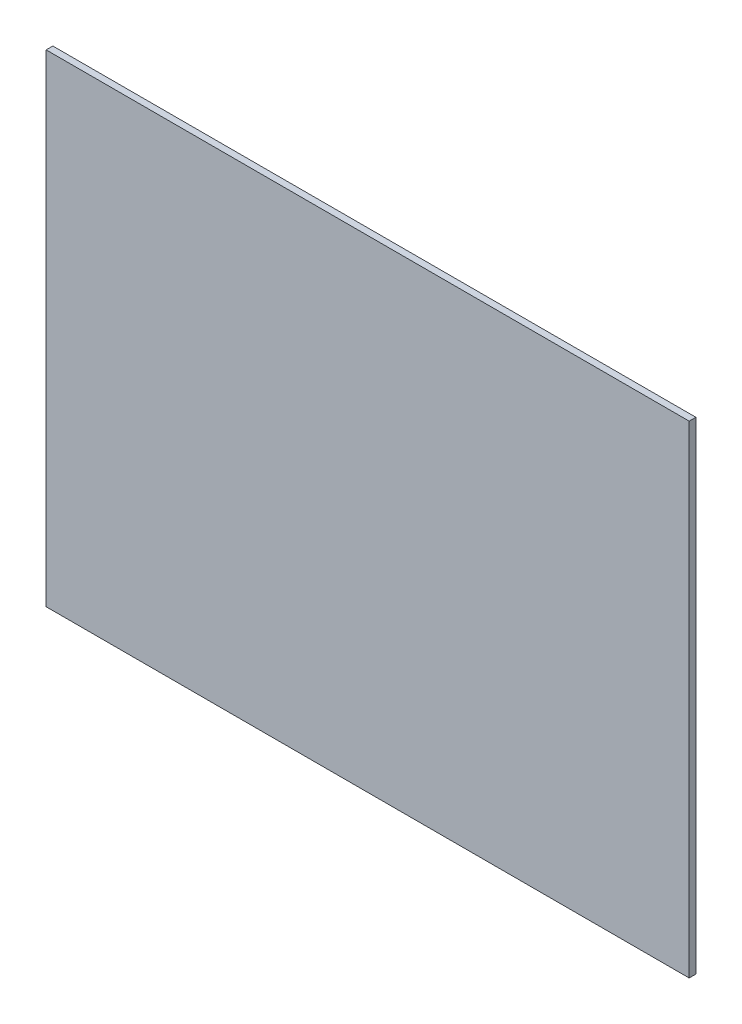
ISO-10303-21;
HEADER;
FILE_DESCRIPTION(('STEP AP214'),'2;1');
FILE_NAME('part.step','',(''),(''),'','','');
FILE_SCHEMA(('AUTOMOTIVE_DESIGN { 1 0 10303 214 1 1 1 1 }'));
ENDSEC;
DATA;
#1=APPLICATION_CONTEXT('core data for automotive mechanical design processes');
#2=APPLICATION_PROTOCOL_DEFINITION('international standard','automotive_design',2000,#1);
#3=PRODUCT_CONTEXT('',#1,'mechanical');
#4=PRODUCT('Part','Part','',(#3));
#5=PRODUCT_RELATED_PRODUCT_CATEGORY('part','',(#4));
#6=PRODUCT_DEFINITION_FORMATION('','',#4);
#7=PRODUCT_DEFINITION_CONTEXT('part definition',#1,'design');
#8=PRODUCT_DEFINITION('design','',#6,#7);
#9=PRODUCT_DEFINITION_SHAPE('','',#8);
#10=(LENGTH_UNIT() NAMED_UNIT(*) SI_UNIT(.MILLI.,.METRE.));
#11=(NAMED_UNIT(*) PLANE_ANGLE_UNIT() SI_UNIT($,.RADIAN.));
#12=(NAMED_UNIT(*) SI_UNIT($,.STERADIAN.) SOLID_ANGLE_UNIT());
#13=UNCERTAINTY_MEASURE_WITH_UNIT(LENGTH_MEASURE(1.E-05),#10,'distance_accuracy_value','');
#14=(GEOMETRIC_REPRESENTATION_CONTEXT(3) GLOBAL_UNCERTAINTY_ASSIGNED_CONTEXT((#13)) GLOBAL_UNIT_ASSIGNED_CONTEXT((#10,
#11,#12)) REPRESENTATION_CONTEXT('',''));
#15=CARTESIAN_POINT('',(0.,0.,0.));
#16=DIRECTION('',(0.,0.,1.));
#17=DIRECTION('',(1.,0.,0.));
#18=AXIS2_PLACEMENT_3D('',#15,#16,#17);
#19=CARTESIAN_POINT('',(304.8,228.6,6.35));
#20=DIRECTION('',(-1.,0.,0.));
#21=DIRECTION('',(0.,-1.,0.));
#22=AXIS2_PLACEMENT_3D('',#19,#20,#21);
#23=PLANE('',#22);
#24=DIRECTION('',(0.,1.,0.));
#25=VECTOR('',#24,1.);
#26=CARTESIAN_POINT('',(304.8,228.6,0.));
#27=LINE('',#26,#25);
#28=CARTESIAN_POINT('',(304.8,-228.6,0.));
#29=VERTEX_POINT('',#28);
#30=CARTESIAN_POINT('',(304.8,228.6,0.));
#31=VERTEX_POINT('',#30);
#32=EDGE_CURVE('E102',#29,#31,#27,.T.);
#33=ORIENTED_EDGE('',*,*,#32,.T.);
#34=DIRECTION('',(0.,0.,-1.));
#35=VECTOR('',#34,1.);
#36=CARTESIAN_POINT('',(304.8,228.6,6.35));
#37=LINE('',#36,#35);
#38=CARTESIAN_POINT('',(304.8,228.6,6.35));
#39=VERTEX_POINT('',#38);
#40=EDGE_CURVE('E11',#39,#31,#37,.T.);
#41=ORIENTED_EDGE('',*,*,#40,.F.);
#42=DIRECTION('',(0.,1.,0.));
#43=VECTOR('',#42,1.);
#44=CARTESIAN_POINT('',(304.8,228.6,6.35));
#45=LINE('',#44,#43);
#46=CARTESIAN_POINT('',(304.8,-228.6,6.35));
#47=VERTEX_POINT('',#46);
#48=EDGE_CURVE('E90',#47,#39,#45,.T.);
#49=ORIENTED_EDGE('',*,*,#48,.F.);
#50=DIRECTION('',(0.,0.,-1.));
#51=VECTOR('',#50,1.);
#52=CARTESIAN_POINT('',(304.8,-228.6,6.35));
#53=LINE('',#52,#51);
#54=EDGE_CURVE('E98',#47,#29,#53,.T.);
#55=ORIENTED_EDGE('',*,*,#54,.T.);
#56=EDGE_LOOP('',(#33,#41,#49,#55));
#57=FACE_BOUND('',#56,.T.);
#58=ADVANCED_FACE('F39',(#57),#23,.F.);
#59=CARTESIAN_POINT('',(-304.8,228.6,6.35));
#60=DIRECTION('',(0.,-1.,0.));
#61=DIRECTION('',(0.,0.,-1.));
#62=AXIS2_PLACEMENT_3D('',#59,#60,#61);
#63=PLANE('',#62);
#64=DIRECTION('',(-1.,0.,0.));
#65=VECTOR('',#64,1.);
#66=CARTESIAN_POINT('',(-304.8,228.6,0.));
#67=LINE('',#66,#65);
#68=CARTESIAN_POINT('',(-304.8,228.6,0.));
#69=VERTEX_POINT('',#68);
#70=EDGE_CURVE('E94',#31,#69,#67,.T.);
#71=ORIENTED_EDGE('',*,*,#70,.T.);
#72=DIRECTION('',(0.,0.,-1.));
#73=VECTOR('',#72,1.);
#74=CARTESIAN_POINT('',(-304.8,228.6,6.35));
#75=LINE('',#74,#73);
#76=CARTESIAN_POINT('',(-304.8,228.6,6.35));
#77=VERTEX_POINT('',#76);
#78=EDGE_CURVE('E47',#77,#69,#75,.T.);
#79=ORIENTED_EDGE('',*,*,#78,.F.);
#80=DIRECTION('',(-1.,0.,0.));
#81=VECTOR('',#80,1.);
#82=CARTESIAN_POINT('',(-304.8,228.6,6.35));
#83=LINE('',#82,#81);
#84=EDGE_CURVE('E85',#39,#77,#83,.T.);
#85=ORIENTED_EDGE('',*,*,#84,.F.);
#86=ORIENTED_EDGE('',*,*,#40,.T.);
#87=EDGE_LOOP('',(#71,#79,#85,#86));
#88=FACE_BOUND('',#87,.T.);
#89=ADVANCED_FACE('F93',(#88),#63,.F.);
#90=CARTESIAN_POINT('',(-304.8,228.6,6.35));
#91=DIRECTION('',(1.,0.,0.));
#92=DIRECTION('',(0.,1.,0.));
#93=AXIS2_PLACEMENT_3D('',#90,#91,#92);
#94=PLANE('',#93);
#95=DIRECTION('',(0.,-1.,0.));
#96=VECTOR('',#95,1.);
#97=CARTESIAN_POINT('',(-304.8,228.6,0.));
#98=LINE('',#97,#96);
#99=CARTESIAN_POINT('',(-304.8,-228.6,0.));
#100=VERTEX_POINT('',#99);
#101=EDGE_CURVE('E72',#69,#100,#98,.T.);
#102=ORIENTED_EDGE('',*,*,#101,.T.);
#103=DIRECTION('',(0.,0.,-1.));
#104=VECTOR('',#103,1.);
#105=CARTESIAN_POINT('',(-304.8,-228.6,6.35));
#106=LINE('',#105,#104);
#107=CARTESIAN_POINT('',(-304.8,-228.6,6.35));
#108=VERTEX_POINT('',#107);
#109=EDGE_CURVE('E95',#108,#100,#106,.T.);
#110=ORIENTED_EDGE('',*,*,#109,.F.);
#111=DIRECTION('',(0.,-1.,0.));
#112=VECTOR('',#111,1.);
#113=CARTESIAN_POINT('',(-304.8,228.6,6.35));
#114=LINE('',#113,#112);
#115=EDGE_CURVE('E88',#77,#108,#114,.T.);
#116=ORIENTED_EDGE('',*,*,#115,.F.);
#117=ORIENTED_EDGE('',*,*,#78,.T.);
#118=EDGE_LOOP('',(#102,#110,#116,#117));
#119=FACE_BOUND('',#118,.T.);
#120=ADVANCED_FACE('F96',(#119),#94,.F.);
#121=CARTESIAN_POINT('',(-304.8,-228.6,6.35));
#122=DIRECTION('',(0.,1.,0.));
#123=DIRECTION('',(0.,0.,1.));
#124=AXIS2_PLACEMENT_3D('',#121,#122,#123);
#125=PLANE('',#124);
#126=DIRECTION('',(1.,0.,0.));
#127=VECTOR('',#126,1.);
#128=CARTESIAN_POINT('',(-304.8,-228.6,0.));
#129=LINE('',#128,#127);
#130=EDGE_CURVE('E78',#100,#29,#129,.T.);
#131=ORIENTED_EDGE('',*,*,#130,.T.);
#132=ORIENTED_EDGE('',*,*,#54,.F.);
#133=DIRECTION('',(1.,0.,0.));
#134=VECTOR('',#133,1.);
#135=CARTESIAN_POINT('',(-304.8,-228.6,6.35));
#136=LINE('',#135,#134);
#137=EDGE_CURVE('E55',#108,#47,#136,.T.);
#138=ORIENTED_EDGE('',*,*,#137,.F.);
#139=ORIENTED_EDGE('',*,*,#109,.T.);
#140=EDGE_LOOP('',(#131,#132,#138,#139));
#141=FACE_BOUND('',#140,.T.);
#142=ADVANCED_FACE('F109',(#141),#125,.F.);
#143=CARTESIAN_POINT('',(0.,0.,6.35));
#144=DIRECTION('',(0.,0.,1.));
#145=DIRECTION('',(1.,0.,0.));
#146=AXIS2_PLACEMENT_3D('',#143,#144,#145);
#147=PLANE('',#146);
#148=ORIENTED_EDGE('',*,*,#48,.T.);
#149=ORIENTED_EDGE('',*,*,#84,.T.);
#150=ORIENTED_EDGE('',*,*,#115,.T.);
#151=ORIENTED_EDGE('',*,*,#137,.T.);
#152=EDGE_LOOP('',(#148,#149,#150,#151));
#153=FACE_BOUND('',#152,.T.);
#154=ADVANCED_FACE('F86',(#153),#147,.T.);
#155=CARTESIAN_POINT('',(0.,0.,0.));
#156=DIRECTION('',(0.,0.,1.));
#157=DIRECTION('',(1.,0.,0.));
#158=AXIS2_PLACEMENT_3D('',#155,#156,#157);
#159=PLANE('',#158);
#160=ORIENTED_EDGE('',*,*,#32,.F.);
#161=ORIENTED_EDGE('',*,*,#130,.F.);
#162=ORIENTED_EDGE('',*,*,#101,.F.);
#163=ORIENTED_EDGE('',*,*,#70,.F.);
#164=EDGE_LOOP('',(#160,#161,#162,#163));
#165=FACE_BOUND('',#164,.T.);
#166=ADVANCED_FACE('F112',(#165),#159,.F.);
#167=CLOSED_SHELL('',(#58,#89,#120,#142,#154,#166));
#168=MANIFOLD_SOLID_BREP('B2',#167);
#169=ADVANCED_BREP_SHAPE_REPRESENTATION('',(#18,#168),#14);
#170=SHAPE_DEFINITION_REPRESENTATION(#9,#169);
ENDSEC;
END-ISO-10303-21;
